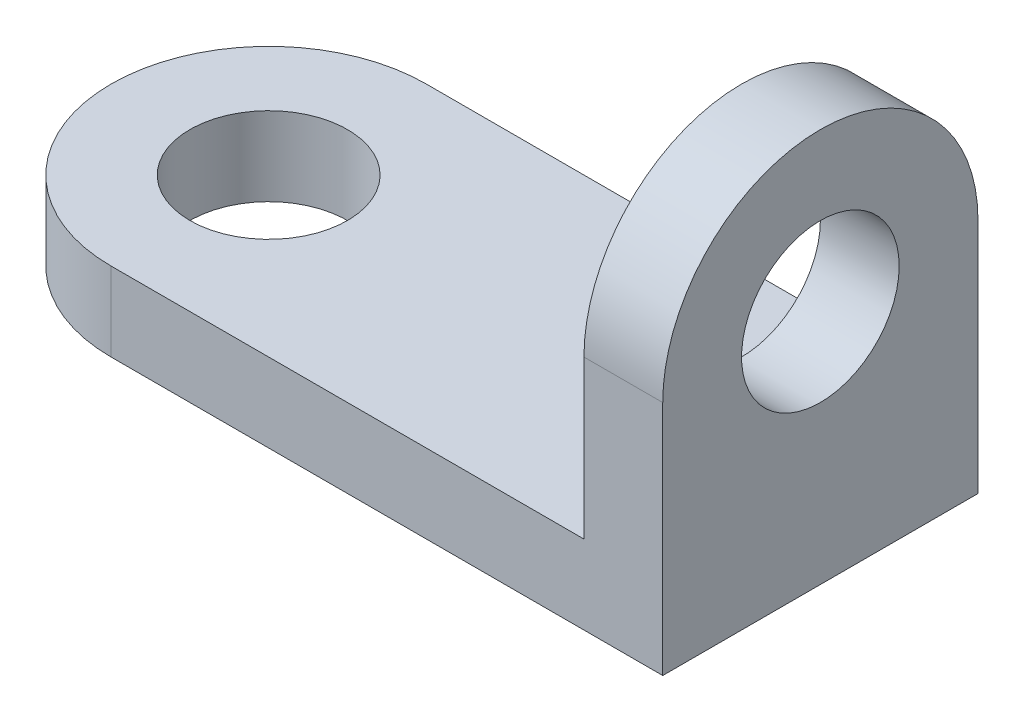
ISO-10303-21;
HEADER;
FILE_DESCRIPTION(('STEP AP214'),'2;1');
FILE_NAME('part.step','',(''),(''),'','','');
FILE_SCHEMA(('AUTOMOTIVE_DESIGN { 1 0 10303 214 1 1 1 1 }'));
ENDSEC;
DATA;
#1=APPLICATION_CONTEXT('core data for automotive mechanical design processes');
#2=APPLICATION_PROTOCOL_DEFINITION('international standard','automotive_design',2000,#1);
#3=PRODUCT_CONTEXT('',#1,'mechanical');
#4=PRODUCT('Part','Part','',(#3));
#5=PRODUCT_RELATED_PRODUCT_CATEGORY('part','',(#4));
#6=PRODUCT_DEFINITION_FORMATION('','',#4);
#7=PRODUCT_DEFINITION_CONTEXT('part definition',#1,'design');
#8=PRODUCT_DEFINITION('design','',#6,#7);
#9=PRODUCT_DEFINITION_SHAPE('','',#8);
#10=(LENGTH_UNIT() NAMED_UNIT(*) SI_UNIT(.MILLI.,.METRE.));
#11=(NAMED_UNIT(*) PLANE_ANGLE_UNIT() SI_UNIT($,.RADIAN.));
#12=(NAMED_UNIT(*) SI_UNIT($,.STERADIAN.) SOLID_ANGLE_UNIT());
#13=UNCERTAINTY_MEASURE_WITH_UNIT(LENGTH_MEASURE(1.E-05),#10,'distance_accuracy_value','');
#14=(GEOMETRIC_REPRESENTATION_CONTEXT(3) GLOBAL_UNCERTAINTY_ASSIGNED_CONTEXT((#13)) GLOBAL_UNIT_ASSIGNED_CONTEXT((#10,
#11,#12)) REPRESENTATION_CONTEXT('',''));
#15=CARTESIAN_POINT('',(0.,0.,0.));
#16=DIRECTION('',(0.,0.,1.));
#17=DIRECTION('',(1.,0.,0.));
#18=AXIS2_PLACEMENT_3D('',#15,#16,#17);
#19=CARTESIAN_POINT('',(-35.,10.,0.));
#20=DIRECTION('',(0.,1.,0.));
#21=DIRECTION('',(0.,0.,1.));
#22=AXIS2_PLACEMENT_3D('',#19,#20,#21);
#23=PLANE('',#22);
#24=CARTESIAN_POINT('',(-35.,10.,0.));
#25=DIRECTION('',(0.,1.,0.));
#26=DIRECTION('',(0.,0.,1.));
#27=AXIS2_PLACEMENT_3D('',#24,#25,#26);
#28=CIRCLE('',#27,10.);
#29=CARTESIAN_POINT('',(-35.,10.,10.));
#30=VERTEX_POINT('',#29);
#31=EDGE_CURVE('E107',#30,#30,#28,.T.);
#32=ORIENTED_EDGE('',*,*,#31,.F.);
#33=EDGE_LOOP('',(#32));
#34=FACE_BOUND('',#33,.T.);
#35=DIRECTION('',(1.,0.,0.));
#36=VECTOR('',#35,1.);
#37=CARTESIAN_POINT('',(-35.,10.,20.));
#38=LINE('',#37,#36);
#39=CARTESIAN_POINT('',(-35.,10.,20.));
#40=VERTEX_POINT('',#39);
#41=CARTESIAN_POINT('',(25.,10.,20.));
#42=VERTEX_POINT('',#41);
#43=EDGE_CURVE('E102',#40,#42,#38,.T.);
#44=ORIENTED_EDGE('',*,*,#43,.T.);
#45=DIRECTION('',(0.,0.,-1.));
#46=VECTOR('',#45,1.);
#47=CARTESIAN_POINT('',(25.,10.,20.));
#48=LINE('',#47,#46);
#49=CARTESIAN_POINT('',(25.,10.,-20.));
#50=VERTEX_POINT('',#49);
#51=EDGE_CURVE('E135',#42,#50,#48,.T.);
#52=ORIENTED_EDGE('',*,*,#51,.T.);
#53=DIRECTION('',(-1.,0.,0.));
#54=VECTOR('',#53,1.);
#55=CARTESIAN_POINT('',(-35.,10.,-20.));
#56=LINE('',#55,#54);
#57=CARTESIAN_POINT('',(-35.,10.,-20.));
#58=VERTEX_POINT('',#57);
#59=EDGE_CURVE('E91',#50,#58,#56,.T.);
#60=ORIENTED_EDGE('',*,*,#59,.T.);
#61=CARTESIAN_POINT('',(-35.,10.,0.));
#62=DIRECTION('',(0.,1.,0.));
#63=DIRECTION('',(0.,0.,1.));
#64=AXIS2_PLACEMENT_3D('',#61,#62,#63);
#65=CIRCLE('',#64,20.);
#66=EDGE_CURVE('E59',#58,#40,#65,.T.);
#67=ORIENTED_EDGE('',*,*,#66,.T.);
#68=EDGE_LOOP('',(#44,#52,#60,#67));
#69=FACE_BOUND('',#68,.T.);
#70=ADVANCED_FACE('F35',(#34,#69),#23,.T.);
#71=CARTESIAN_POINT('',(-35.,0.,0.));
#72=DIRECTION('',(0.,1.,0.));
#73=DIRECTION('',(0.,0.,1.));
#74=AXIS2_PLACEMENT_3D('',#71,#72,#73);
#75=PLANE('',#74);
#76=DIRECTION('',(0.,0.,-1.));
#77=VECTOR('',#76,1.);
#78=CARTESIAN_POINT('',(35.,0.,-20.));
#79=LINE('',#78,#77);
#80=CARTESIAN_POINT('',(35.,0.,20.));
#81=VERTEX_POINT('',#80);
#82=CARTESIAN_POINT('',(35.,0.,-20.));
#83=VERTEX_POINT('',#82);
#84=EDGE_CURVE('E99',#81,#83,#79,.T.);
#85=ORIENTED_EDGE('',*,*,#84,.F.);
#86=DIRECTION('',(1.,0.,0.));
#87=VECTOR('',#86,1.);
#88=CARTESIAN_POINT('',(-35.,0.,20.));
#89=LINE('',#88,#87);
#90=CARTESIAN_POINT('',(-35.,0.,20.));
#91=VERTEX_POINT('',#90);
#92=EDGE_CURVE('E79',#91,#81,#89,.T.);
#93=ORIENTED_EDGE('',*,*,#92,.F.);
#94=CARTESIAN_POINT('',(-35.,0.,0.));
#95=DIRECTION('',(0.,1.,0.));
#96=DIRECTION('',(0.,0.,1.));
#97=AXIS2_PLACEMENT_3D('',#94,#95,#96);
#98=CIRCLE('',#97,20.);
#99=CARTESIAN_POINT('',(-35.,0.,-20.));
#100=VERTEX_POINT('',#99);
#101=EDGE_CURVE('E92',#100,#91,#98,.T.);
#102=ORIENTED_EDGE('',*,*,#101,.F.);
#103=DIRECTION('',(-1.,0.,0.));
#104=VECTOR('',#103,1.);
#105=CARTESIAN_POINT('',(-35.,0.,-20.));
#106=LINE('',#105,#104);
#107=EDGE_CURVE('E106',#83,#100,#106,.T.);
#108=ORIENTED_EDGE('',*,*,#107,.F.);
#109=EDGE_LOOP('',(#85,#93,#102,#108));
#110=FACE_BOUND('',#109,.T.);
#111=CARTESIAN_POINT('',(-35.,0.,0.));
#112=DIRECTION('',(0.,1.,0.));
#113=DIRECTION('',(0.,0.,1.));
#114=AXIS2_PLACEMENT_3D('',#111,#112,#113);
#115=CIRCLE('',#114,10.);
#116=CARTESIAN_POINT('',(-35.,0.,10.));
#117=VERTEX_POINT('',#116);
#118=EDGE_CURVE('E111',#117,#117,#115,.T.);
#119=ORIENTED_EDGE('',*,*,#118,.T.);
#120=EDGE_LOOP('',(#119));
#121=FACE_BOUND('',#120,.T.);
#122=ADVANCED_FACE('F104',(#110,#121),#75,.F.);
#123=CARTESIAN_POINT('',(35.,10.,-20.));
#124=DIRECTION('',(-1.,0.,0.));
#125=DIRECTION('',(0.,0.,1.));
#126=AXIS2_PLACEMENT_3D('',#123,#124,#125);
#127=PLANE('',#126);
#128=ORIENTED_EDGE('',*,*,#84,.T.);
#129=DIRECTION('',(0.,-1.,0.));
#130=VECTOR('',#129,1.);
#131=CARTESIAN_POINT('',(35.,10.,-20.));
#132=LINE('',#131,#130);
#133=CARTESIAN_POINT('',(35.,30.,-20.));
#134=VERTEX_POINT('',#133);
#135=EDGE_CURVE('E11',#134,#83,#132,.T.);
#136=ORIENTED_EDGE('',*,*,#135,.F.);
#137=CARTESIAN_POINT('',(35.,30.,0.));
#138=DIRECTION('',(1.,0.,0.));
#139=DIRECTION('',(0.,0.,1.));
#140=AXIS2_PLACEMENT_3D('',#137,#138,#139);
#141=CIRCLE('',#140,20.);
#142=CARTESIAN_POINT('',(35.,30.,20.));
#143=VERTEX_POINT('',#142);
#144=EDGE_CURVE('E101',#134,#143,#141,.T.);
#145=ORIENTED_EDGE('',*,*,#144,.T.);
#146=DIRECTION('',(0.,-1.,0.));
#147=VECTOR('',#146,1.);
#148=CARTESIAN_POINT('',(35.,10.,20.));
#149=LINE('',#148,#147);
#150=EDGE_CURVE('E84',#143,#81,#149,.T.);
#151=ORIENTED_EDGE('',*,*,#150,.T.);
#152=EDGE_LOOP('',(#128,#136,#145,#151));
#153=FACE_BOUND('',#152,.T.);
#154=CARTESIAN_POINT('',(35.,30.,0.));
#155=DIRECTION('',(1.,0.,0.));
#156=DIRECTION('',(0.,0.,-1.));
#157=AXIS2_PLACEMENT_3D('',#154,#155,#156);
#158=CIRCLE('',#157,10.);
#159=CARTESIAN_POINT('',(35.,30.,-10.));
#160=VERTEX_POINT('',#159);
#161=EDGE_CURVE('E154',#160,#160,#158,.T.);
#162=ORIENTED_EDGE('',*,*,#161,.F.);
#163=EDGE_LOOP('',(#162));
#164=FACE_BOUND('',#163,.T.);
#165=ADVANCED_FACE('F37',(#153,#164),#127,.F.);
#166=CARTESIAN_POINT('',(-35.,10.,-20.));
#167=DIRECTION('',(0.,0.,1.));
#168=DIRECTION('',(1.,0.,0.));
#169=AXIS2_PLACEMENT_3D('',#166,#167,#168);
#170=PLANE('',#169);
#171=ORIENTED_EDGE('',*,*,#107,.T.);
#172=DIRECTION('',(0.,-1.,0.));
#173=VECTOR('',#172,1.);
#174=CARTESIAN_POINT('',(-35.,10.,-20.));
#175=LINE('',#174,#173);
#176=EDGE_CURVE('E43',#58,#100,#175,.T.);
#177=ORIENTED_EDGE('',*,*,#176,.F.);
#178=ORIENTED_EDGE('',*,*,#59,.F.);
#179=DIRECTION('',(0.,1.,0.));
#180=VECTOR('',#179,1.);
#181=CARTESIAN_POINT('',(25.,10.,-20.));
#182=LINE('',#181,#180);
#183=CARTESIAN_POINT('',(25.,30.,-20.));
#184=VERTEX_POINT('',#183);
#185=EDGE_CURVE('E50',#50,#184,#182,.T.);
#186=ORIENTED_EDGE('',*,*,#185,.T.);
#187=DIRECTION('',(1.,0.,0.));
#188=VECTOR('',#187,1.);
#189=CARTESIAN_POINT('',(25.,30.,-20.));
#190=LINE('',#189,#188);
#191=EDGE_CURVE('E127',#184,#134,#190,.T.);
#192=ORIENTED_EDGE('',*,*,#191,.T.);
#193=ORIENTED_EDGE('',*,*,#135,.T.);
#194=EDGE_LOOP('',(#171,#177,#178,#186,#192,#193));
#195=FACE_BOUND('',#194,.T.);
#196=ADVANCED_FACE('F123',(#195),#170,.F.);
#197=CARTESIAN_POINT('',(-35.,10.,0.));
#198=DIRECTION('',(0.,-1.,0.));
#199=DIRECTION('',(0.,0.,-1.));
#200=AXIS2_PLACEMENT_3D('',#197,#198,#199);
#201=CYLINDRICAL_SURFACE('',#200,20.);
#202=ORIENTED_EDGE('',*,*,#101,.T.);
#203=DIRECTION('',(0.,-1.,0.));
#204=VECTOR('',#203,1.);
#205=CARTESIAN_POINT('',(-35.,10.,20.));
#206=LINE('',#205,#204);
#207=EDGE_CURVE('E87',#40,#91,#206,.T.);
#208=ORIENTED_EDGE('',*,*,#207,.F.);
#209=ORIENTED_EDGE('',*,*,#66,.F.);
#210=ORIENTED_EDGE('',*,*,#176,.T.);
#211=EDGE_LOOP('',(#202,#208,#209,#210));
#212=FACE_BOUND('',#211,.T.);
#213=ADVANCED_FACE('F120',(#212),#201,.T.);
#214=CARTESIAN_POINT('',(-35.,10.,20.));
#215=DIRECTION('',(0.,0.,-1.));
#216=DIRECTION('',(-1.,0.,0.));
#217=AXIS2_PLACEMENT_3D('',#214,#215,#216);
#218=PLANE('',#217);
#219=ORIENTED_EDGE('',*,*,#92,.T.);
#220=ORIENTED_EDGE('',*,*,#150,.F.);
#221=DIRECTION('',(1.,0.,0.));
#222=VECTOR('',#221,1.);
#223=CARTESIAN_POINT('',(25.,30.,20.));
#224=LINE('',#223,#222);
#225=CARTESIAN_POINT('',(25.,30.,20.));
#226=VERTEX_POINT('',#225);
#227=EDGE_CURVE('E141',#226,#143,#224,.T.);
#228=ORIENTED_EDGE('',*,*,#227,.F.);
#229=DIRECTION('',(0.,-1.,0.));
#230=VECTOR('',#229,1.);
#231=CARTESIAN_POINT('',(25.,10.,20.));
#232=LINE('',#231,#230);
#233=EDGE_CURVE('E138',#226,#42,#232,.T.);
#234=ORIENTED_EDGE('',*,*,#233,.T.);
#235=ORIENTED_EDGE('',*,*,#43,.F.);
#236=ORIENTED_EDGE('',*,*,#207,.T.);
#237=EDGE_LOOP('',(#219,#220,#228,#234,#235,#236));
#238=FACE_BOUND('',#237,.T.);
#239=ADVANCED_FACE('F81',(#238),#218,.F.);
#240=CARTESIAN_POINT('',(-35.,10.,0.));
#241=DIRECTION('',(0.,-1.,0.));
#242=DIRECTION('',(0.,0.,-1.));
#243=AXIS2_PLACEMENT_3D('',#240,#241,#242);
#244=CYLINDRICAL_SURFACE('',#243,10.);
#245=ORIENTED_EDGE('',*,*,#31,.T.);
#246=EDGE_LOOP('',(#245));
#247=FACE_BOUND('',#246,.T.);
#248=ORIENTED_EDGE('',*,*,#118,.F.);
#249=EDGE_LOOP('',(#248));
#250=FACE_BOUND('',#249,.T.);
#251=ADVANCED_FACE('F179',(#247,#250),#244,.F.);
#252=CARTESIAN_POINT('',(25.,30.,0.));
#253=DIRECTION('',(1.,0.,0.));
#254=DIRECTION('',(0.,0.,-1.));
#255=AXIS2_PLACEMENT_3D('',#252,#253,#254);
#256=CYLINDRICAL_SURFACE('',#255,20.);
#257=ORIENTED_EDGE('',*,*,#144,.F.);
#258=ORIENTED_EDGE('',*,*,#191,.F.);
#259=CARTESIAN_POINT('',(25.,30.,0.));
#260=DIRECTION('',(1.,0.,0.));
#261=DIRECTION('',(0.,0.,1.));
#262=AXIS2_PLACEMENT_3D('',#259,#260,#261);
#263=CIRCLE('',#262,20.);
#264=EDGE_CURVE('E148',#184,#226,#263,.T.);
#265=ORIENTED_EDGE('',*,*,#264,.T.);
#266=ORIENTED_EDGE('',*,*,#227,.T.);
#267=EDGE_LOOP('',(#257,#258,#265,#266));
#268=FACE_BOUND('',#267,.T.);
#269=ADVANCED_FACE('F201',(#268),#256,.T.);
#270=CARTESIAN_POINT('',(25.,30.,0.));
#271=DIRECTION('',(-1.,0.,0.));
#272=DIRECTION('',(0.,0.,1.));
#273=AXIS2_PLACEMENT_3D('',#270,#271,#272);
#274=PLANE('',#273);
#275=CARTESIAN_POINT('',(25.,30.,0.));
#276=DIRECTION('',(1.,0.,0.));
#277=DIRECTION('',(0.,0.,-1.));
#278=AXIS2_PLACEMENT_3D('',#275,#276,#277);
#279=CIRCLE('',#278,10.);
#280=CARTESIAN_POINT('',(25.,30.,-10.));
#281=VERTEX_POINT('',#280);
#282=EDGE_CURVE('E151',#281,#281,#279,.T.);
#283=ORIENTED_EDGE('',*,*,#282,.T.);
#284=EDGE_LOOP('',(#283));
#285=FACE_BOUND('',#284,.T.);
#286=ORIENTED_EDGE('',*,*,#233,.F.);
#287=ORIENTED_EDGE('',*,*,#264,.F.);
#288=ORIENTED_EDGE('',*,*,#185,.F.);
#289=ORIENTED_EDGE('',*,*,#51,.F.);
#290=EDGE_LOOP('',(#286,#287,#288,#289));
#291=FACE_BOUND('',#290,.T.);
#292=ADVANCED_FACE('F137',(#285,#291),#274,.T.);
#293=CARTESIAN_POINT('',(25.,30.,0.));
#294=DIRECTION('',(1.,0.,0.));
#295=DIRECTION('',(0.,0.,-1.));
#296=AXIS2_PLACEMENT_3D('',#293,#294,#295);
#297=CYLINDRICAL_SURFACE('',#296,10.);
#298=ORIENTED_EDGE('',*,*,#282,.F.);
#299=EDGE_LOOP('',(#298));
#300=FACE_BOUND('',#299,.T.);
#301=ORIENTED_EDGE('',*,*,#161,.T.);
#302=EDGE_LOOP('',(#301));
#303=FACE_BOUND('',#302,.T.);
#304=ADVANCED_FACE('F161',(#300,#303),#297,.F.);
#305=CLOSED_SHELL('',(#70,#122,#165,#196,#213,#239,#251,#269,#292,#304));
#306=MANIFOLD_SOLID_BREP('B2',#305);
#307=ADVANCED_BREP_SHAPE_REPRESENTATION('',(#18,#306),#14);
#308=SHAPE_DEFINITION_REPRESENTATION(#9,#307);
ENDSEC;
END-ISO-10303-21;
